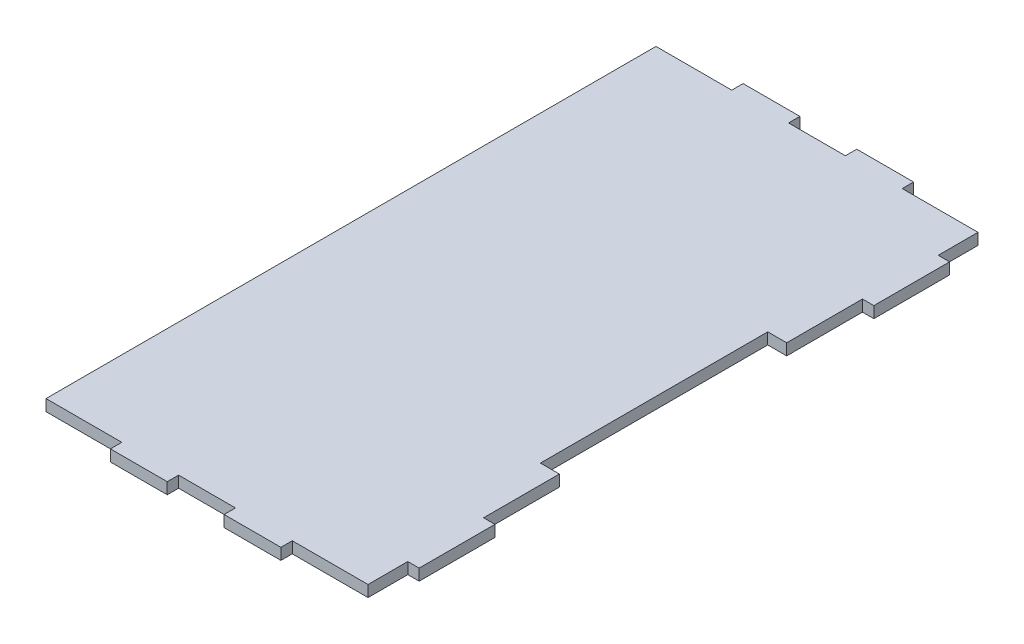
ISO-10303-21;
HEADER;
FILE_DESCRIPTION(('STEP AP214'),'2;1');
FILE_NAME('part.step','',(''),(''),'','','');
FILE_SCHEMA(('AUTOMOTIVE_DESIGN { 1 0 10303 214 1 1 1 1 }'));
ENDSEC;
DATA;
#1=APPLICATION_CONTEXT('core data for automotive mechanical design processes');
#2=APPLICATION_PROTOCOL_DEFINITION('international standard','automotive_design',2000,#1);
#3=PRODUCT_CONTEXT('',#1,'mechanical');
#4=PRODUCT('Part','Part','',(#3));
#5=PRODUCT_RELATED_PRODUCT_CATEGORY('part','',(#4));
#6=PRODUCT_DEFINITION_FORMATION('','',#4);
#7=PRODUCT_DEFINITION_CONTEXT('part definition',#1,'design');
#8=PRODUCT_DEFINITION('design','',#6,#7);
#9=PRODUCT_DEFINITION_SHAPE('','',#8);
#10=(LENGTH_UNIT() NAMED_UNIT(*) SI_UNIT(.MILLI.,.METRE.));
#11=(NAMED_UNIT(*) PLANE_ANGLE_UNIT() SI_UNIT($,.RADIAN.));
#12=(NAMED_UNIT(*) SI_UNIT($,.STERADIAN.) SOLID_ANGLE_UNIT());
#13=UNCERTAINTY_MEASURE_WITH_UNIT(LENGTH_MEASURE(1.E-05),#10,'distance_accuracy_value','');
#14=(GEOMETRIC_REPRESENTATION_CONTEXT(3) GLOBAL_UNCERTAINTY_ASSIGNED_CONTEXT((#13)) GLOBAL_UNIT_ASSIGNED_CONTEXT((#10,
#11,#12)) REPRESENTATION_CONTEXT('',''));
#15=CARTESIAN_POINT('',(0.,0.,0.));
#16=DIRECTION('',(0.,0.,1.));
#17=DIRECTION('',(1.,0.,0.));
#18=AXIS2_PLACEMENT_3D('',#15,#16,#17);
#19=CARTESIAN_POINT('',(0.,3.,-53.));
#20=DIRECTION('',(0.,0.,-1.));
#21=DIRECTION('',(-1.,0.,0.));
#22=AXIS2_PLACEMENT_3D('',#19,#20,#21);
#23=PLANE('',#22);
#24=DIRECTION('',(1.,0.,0.));
#25=VECTOR('',#24,1.);
#26=CARTESIAN_POINT('',(0.,0.,-53.));
#27=LINE('',#26,#25);
#28=CARTESIAN_POINT('',(85.5,0.,-53.));
#29=VERTEX_POINT('',#28);
#30=CARTESIAN_POINT('',(90.5,0.,-53.));
#31=VERTEX_POINT('',#30);
#32=EDGE_CURVE('E272',#29,#31,#27,.T.);
#33=ORIENTED_EDGE('',*,*,#32,.F.);
#34=DIRECTION('',(0.,-1.,0.));
#35=VECTOR('',#34,1.);
#36=CARTESIAN_POINT('',(85.5,3.,-53.));
#37=LINE('',#36,#35);
#38=CARTESIAN_POINT('',(85.5,3.,-53.));
#39=VERTEX_POINT('',#38);
#40=EDGE_CURVE('E11',#39,#29,#37,.T.);
#41=ORIENTED_EDGE('',*,*,#40,.F.);
#42=DIRECTION('',(1.,0.,0.));
#43=VECTOR('',#42,1.);
#44=CARTESIAN_POINT('',(0.,3.,-53.));
#45=LINE('',#44,#43);
#46=CARTESIAN_POINT('',(90.5,3.,-53.));
#47=VERTEX_POINT('',#46);
#48=EDGE_CURVE('E350',#39,#47,#45,.T.);
#49=ORIENTED_EDGE('',*,*,#48,.T.);
#50=DIRECTION('',(0.,-1.,0.));
#51=VECTOR('',#50,1.);
#52=CARTESIAN_POINT('',(90.5,3.,-53.));
#53=LINE('',#52,#51);
#54=EDGE_CURVE('E51',#47,#31,#53,.T.);
#55=ORIENTED_EDGE('',*,*,#54,.T.);
#56=EDGE_LOOP('',(#33,#41,#49,#55));
#57=FACE_BOUND('',#56,.T.);
#58=ADVANCED_FACE('F35',(#57),#23,.T.);
#59=CARTESIAN_POINT('',(85.5,3.,0.));
#60=DIRECTION('',(1.,0.,0.));
#61=DIRECTION('',(0.,0.,-1.));
#62=AXIS2_PLACEMENT_3D('',#59,#60,#61);
#63=PLANE('',#62);
#64=DIRECTION('',(0.,0.,1.));
#65=VECTOR('',#64,1.);
#66=CARTESIAN_POINT('',(85.5,0.,0.));
#67=LINE('',#66,#65);
#68=CARTESIAN_POINT('',(85.5,0.,-113.));
#69=VERTEX_POINT('',#68);
#70=EDGE_CURVE('E274',#69,#29,#67,.T.);
#71=ORIENTED_EDGE('',*,*,#70,.F.);
#72=DIRECTION('',(0.,-1.,0.));
#73=VECTOR('',#72,1.);
#74=CARTESIAN_POINT('',(85.5,3.,-113.));
#75=LINE('',#74,#73);
#76=CARTESIAN_POINT('',(85.5,3.,-113.));
#77=VERTEX_POINT('',#76);
#78=EDGE_CURVE('E43',#77,#69,#75,.T.);
#79=ORIENTED_EDGE('',*,*,#78,.F.);
#80=DIRECTION('',(0.,0.,1.));
#81=VECTOR('',#80,1.);
#82=CARTESIAN_POINT('',(85.5,3.,0.));
#83=LINE('',#82,#81);
#84=EDGE_CURVE('E915',#77,#39,#83,.T.);
#85=ORIENTED_EDGE('',*,*,#84,.T.);
#86=ORIENTED_EDGE('',*,*,#40,.T.);
#87=EDGE_LOOP('',(#71,#79,#85,#86));
#88=FACE_BOUND('',#87,.T.);
#89=ADVANCED_FACE('F429',(#88),#63,.T.);
#90=CARTESIAN_POINT('',(0.,3.,-113.));
#91=DIRECTION('',(0.,0.,1.));
#92=DIRECTION('',(1.,0.,0.));
#93=AXIS2_PLACEMENT_3D('',#90,#91,#92);
#94=PLANE('',#93);
#95=DIRECTION('',(-1.,0.,0.));
#96=VECTOR('',#95,1.);
#97=CARTESIAN_POINT('',(0.,0.,-113.));
#98=LINE('',#97,#96);
#99=CARTESIAN_POINT('',(90.5,0.,-113.));
#100=VERTEX_POINT('',#99);
#101=EDGE_CURVE('E277',#100,#69,#98,.T.);
#102=ORIENTED_EDGE('',*,*,#101,.F.);
#103=DIRECTION('',(0.,-1.,0.));
#104=VECTOR('',#103,1.);
#105=CARTESIAN_POINT('',(90.5,3.,-113.));
#106=LINE('',#105,#104);
#107=CARTESIAN_POINT('',(90.5,3.,-113.));
#108=VERTEX_POINT('',#107);
#109=EDGE_CURVE('E418',#108,#100,#106,.T.);
#110=ORIENTED_EDGE('',*,*,#109,.F.);
#111=DIRECTION('',(-1.,0.,0.));
#112=VECTOR('',#111,1.);
#113=CARTESIAN_POINT('',(0.,3.,-113.));
#114=LINE('',#113,#112);
#115=EDGE_CURVE('E425',#108,#77,#114,.T.);
#116=ORIENTED_EDGE('',*,*,#115,.T.);
#117=ORIENTED_EDGE('',*,*,#78,.T.);
#118=EDGE_LOOP('',(#102,#110,#116,#117));
#119=FACE_BOUND('',#118,.T.);
#120=ADVANCED_FACE('F423',(#119),#94,.T.);
#121=CARTESIAN_POINT('',(90.5,3.,0.));
#122=DIRECTION('',(-1.,0.,0.));
#123=DIRECTION('',(0.,0.,1.));
#124=AXIS2_PLACEMENT_3D('',#121,#122,#123);
#125=PLANE('',#124);
#126=DIRECTION('',(0.,0.,-1.));
#127=VECTOR('',#126,1.);
#128=CARTESIAN_POINT('',(90.5,0.,0.));
#129=LINE('',#128,#127);
#130=CARTESIAN_POINT('',(90.5,0.,-133.));
#131=VERTEX_POINT('',#130);
#132=EDGE_CURVE('E280',#100,#131,#129,.T.);
#133=ORIENTED_EDGE('',*,*,#132,.T.);
#134=DIRECTION('',(0.,-1.,0.));
#135=VECTOR('',#134,1.);
#136=CARTESIAN_POINT('',(90.5,3.,-133.));
#137=LINE('',#136,#135);
#138=CARTESIAN_POINT('',(90.5,3.,-133.));
#139=VERTEX_POINT('',#138);
#140=EDGE_CURVE('E415',#139,#131,#137,.T.);
#141=ORIENTED_EDGE('',*,*,#140,.F.);
#142=DIRECTION('',(0.,0.,-1.));
#143=VECTOR('',#142,1.);
#144=CARTESIAN_POINT('',(90.5,3.,0.));
#145=LINE('',#144,#143);
#146=EDGE_CURVE('E446',#108,#139,#145,.T.);
#147=ORIENTED_EDGE('',*,*,#146,.F.);
#148=ORIENTED_EDGE('',*,*,#109,.T.);
#149=EDGE_LOOP('',(#133,#141,#147,#148));
#150=FACE_BOUND('',#149,.T.);
#151=ADVANCED_FACE('F437',(#150),#125,.F.);
#152=CARTESIAN_POINT('',(0.,3.,-133.));
#153=DIRECTION('',(0.,0.,-1.));
#154=DIRECTION('',(-1.,0.,0.));
#155=AXIS2_PLACEMENT_3D('',#152,#153,#154);
#156=PLANE('',#155);
#157=DIRECTION('',(1.,0.,0.));
#158=VECTOR('',#157,1.);
#159=CARTESIAN_POINT('',(0.,0.,-133.));
#160=LINE('',#159,#158);
#161=CARTESIAN_POINT('',(93.5,0.,-133.));
#162=VERTEX_POINT('',#161);
#163=EDGE_CURVE('E282',#131,#162,#160,.T.);
#164=ORIENTED_EDGE('',*,*,#163,.T.);
#165=DIRECTION('',(0.,-1.,0.));
#166=VECTOR('',#165,1.);
#167=CARTESIAN_POINT('',(93.5,3.,-133.));
#168=LINE('',#167,#166);
#169=CARTESIAN_POINT('',(93.5,3.,-133.));
#170=VERTEX_POINT('',#169);
#171=EDGE_CURVE('E412',#170,#162,#168,.T.);
#172=ORIENTED_EDGE('',*,*,#171,.F.);
#173=DIRECTION('',(1.,0.,0.));
#174=VECTOR('',#173,1.);
#175=CARTESIAN_POINT('',(0.,3.,-133.));
#176=LINE('',#175,#174);
#177=EDGE_CURVE('E443',#139,#170,#176,.T.);
#178=ORIENTED_EDGE('',*,*,#177,.F.);
#179=ORIENTED_EDGE('',*,*,#140,.T.);
#180=EDGE_LOOP('',(#164,#172,#178,#179));
#181=FACE_BOUND('',#180,.T.);
#182=ADVANCED_FACE('F441',(#181),#156,.F.);
#183=CARTESIAN_POINT('',(93.5,3.,0.));
#184=DIRECTION('',(-1.,0.,0.));
#185=DIRECTION('',(0.,0.,1.));
#186=AXIS2_PLACEMENT_3D('',#183,#184,#185);
#187=PLANE('',#186);
#188=DIRECTION('',(0.,0.,-1.));
#189=VECTOR('',#188,1.);
#190=CARTESIAN_POINT('',(93.5,0.,0.));
#191=LINE('',#190,#189);
#192=CARTESIAN_POINT('',(93.5,0.,-153.));
#193=VERTEX_POINT('',#192);
#194=EDGE_CURVE('E284',#162,#193,#191,.T.);
#195=ORIENTED_EDGE('',*,*,#194,.T.);
#196=DIRECTION('',(0.,-1.,0.));
#197=VECTOR('',#196,1.);
#198=CARTESIAN_POINT('',(93.5,3.,-153.));
#199=LINE('',#198,#197);
#200=CARTESIAN_POINT('',(93.5,3.,-153.));
#201=VERTEX_POINT('',#200);
#202=EDGE_CURVE('E409',#201,#193,#199,.T.);
#203=ORIENTED_EDGE('',*,*,#202,.F.);
#204=DIRECTION('',(0.,0.,-1.));
#205=VECTOR('',#204,1.);
#206=CARTESIAN_POINT('',(93.5,3.,0.));
#207=LINE('',#206,#205);
#208=EDGE_CURVE('E445',#170,#201,#207,.T.);
#209=ORIENTED_EDGE('',*,*,#208,.F.);
#210=ORIENTED_EDGE('',*,*,#171,.T.);
#211=EDGE_LOOP('',(#195,#203,#209,#210));
#212=FACE_BOUND('',#211,.T.);
#213=ADVANCED_FACE('F529',(#212),#187,.F.);
#214=CARTESIAN_POINT('',(0.,3.,-153.));
#215=DIRECTION('',(0.,0.,1.));
#216=DIRECTION('',(1.,0.,0.));
#217=AXIS2_PLACEMENT_3D('',#214,#215,#216);
#218=PLANE('',#217);
#219=DIRECTION('',(-1.,0.,0.));
#220=VECTOR('',#219,1.);
#221=CARTESIAN_POINT('',(0.,0.,-153.));
#222=LINE('',#221,#220);
#223=CARTESIAN_POINT('',(90.5,0.,-153.));
#224=VERTEX_POINT('',#223);
#225=EDGE_CURVE('E286',#193,#224,#222,.T.);
#226=ORIENTED_EDGE('',*,*,#225,.T.);
#227=DIRECTION('',(0.,-1.,0.));
#228=VECTOR('',#227,1.);
#229=CARTESIAN_POINT('',(90.5,3.,-153.));
#230=LINE('',#229,#228);
#231=CARTESIAN_POINT('',(90.5,3.,-153.));
#232=VERTEX_POINT('',#231);
#233=EDGE_CURVE('E406',#232,#224,#230,.T.);
#234=ORIENTED_EDGE('',*,*,#233,.F.);
#235=DIRECTION('',(-1.,0.,0.));
#236=VECTOR('',#235,1.);
#237=CARTESIAN_POINT('',(0.,3.,-153.));
#238=LINE('',#237,#236);
#239=EDGE_CURVE('E448',#201,#232,#238,.T.);
#240=ORIENTED_EDGE('',*,*,#239,.F.);
#241=ORIENTED_EDGE('',*,*,#202,.T.);
#242=EDGE_LOOP('',(#226,#234,#240,#241));
#243=FACE_BOUND('',#242,.T.);
#244=ADVANCED_FACE('F532',(#243),#218,.F.);
#245=CARTESIAN_POINT('',(90.4999999999996,3.,2.39226627925182E-13));
#246=DIRECTION('',(-1.,0.,0.));
#247=DIRECTION('',(0.,0.,1.));
#248=AXIS2_PLACEMENT_3D('',#245,#246,#247);
#249=PLANE('',#248);
#250=DIRECTION('',(0.,0.,-1.));
#251=VECTOR('',#250,1.);
#252=CARTESIAN_POINT('',(90.4999999999996,0.,2.39226627925182E-13));
#253=LINE('',#252,#251);
#254=CARTESIAN_POINT('',(90.5,0.,-163.5));
#255=VERTEX_POINT('',#254);
#256=EDGE_CURVE('E288',#224,#255,#253,.T.);
#257=ORIENTED_EDGE('',*,*,#256,.T.);
#258=DIRECTION('',(0.,-1.,0.));
#259=VECTOR('',#258,1.);
#260=CARTESIAN_POINT('',(90.5,3.,-163.5));
#261=LINE('',#260,#259);
#262=CARTESIAN_POINT('',(90.5,3.,-163.5));
#263=VERTEX_POINT('',#262);
#264=EDGE_CURVE('E403',#263,#255,#261,.T.);
#265=ORIENTED_EDGE('',*,*,#264,.F.);
#266=DIRECTION('',(0.,0.,-1.));
#267=VECTOR('',#266,1.);
#268=CARTESIAN_POINT('',(90.4999999999996,3.,2.39226627925182E-13));
#269=LINE('',#268,#267);
#270=EDGE_CURVE('E454',#232,#263,#269,.T.);
#271=ORIENTED_EDGE('',*,*,#270,.F.);
#272=ORIENTED_EDGE('',*,*,#233,.T.);
#273=EDGE_LOOP('',(#257,#265,#271,#272));
#274=FACE_BOUND('',#273,.T.);
#275=ADVANCED_FACE('F536',(#274),#249,.F.);
#276=CARTESIAN_POINT('',(0.,3.,-163.5));
#277=DIRECTION('',(0.,0.,1.));
#278=DIRECTION('',(1.,0.,0.));
#279=AXIS2_PLACEMENT_3D('',#276,#277,#278);
#280=PLANE('',#279);
#281=DIRECTION('',(-1.,0.,0.));
#282=VECTOR('',#281,1.);
#283=CARTESIAN_POINT('',(0.,0.,-163.5));
#284=LINE('',#283,#282);
#285=CARTESIAN_POINT('',(70.5,0.,-163.5));
#286=VERTEX_POINT('',#285);
#287=EDGE_CURVE('E290',#255,#286,#284,.T.);
#288=ORIENTED_EDGE('',*,*,#287,.T.);
#289=DIRECTION('',(0.,-1.,0.));
#290=VECTOR('',#289,1.);
#291=CARTESIAN_POINT('',(70.5,3.,-163.5));
#292=LINE('',#291,#290);
#293=CARTESIAN_POINT('',(70.5,3.,-163.5));
#294=VERTEX_POINT('',#293);
#295=EDGE_CURVE('E401',#294,#286,#292,.T.);
#296=ORIENTED_EDGE('',*,*,#295,.F.);
#297=DIRECTION('',(-1.,0.,0.));
#298=VECTOR('',#297,1.);
#299=CARTESIAN_POINT('',(0.,3.,-163.5));
#300=LINE('',#299,#298);
#301=EDGE_CURVE('E456',#263,#294,#300,.T.);
#302=ORIENTED_EDGE('',*,*,#301,.F.);
#303=ORIENTED_EDGE('',*,*,#264,.T.);
#304=EDGE_LOOP('',(#288,#296,#302,#303));
#305=FACE_BOUND('',#304,.T.);
#306=ADVANCED_FACE('F540',(#305),#280,.F.);
#307=CARTESIAN_POINT('',(70.5,3.,0.));
#308=DIRECTION('',(1.,0.,0.));
#309=DIRECTION('',(0.,0.,-1.));
#310=AXIS2_PLACEMENT_3D('',#307,#308,#309);
#311=PLANE('',#310);
#312=DIRECTION('',(0.,0.,1.));
#313=VECTOR('',#312,1.);
#314=CARTESIAN_POINT('',(70.5,0.,0.));
#315=LINE('',#314,#313);
#316=CARTESIAN_POINT('',(70.5,0.,-166.5));
#317=VERTEX_POINT('',#316);
#318=EDGE_CURVE('E293',#317,#286,#315,.T.);
#319=ORIENTED_EDGE('',*,*,#318,.F.);
#320=DIRECTION('',(0.,-1.,0.));
#321=VECTOR('',#320,1.);
#322=CARTESIAN_POINT('',(70.5,3.,-166.5));
#323=LINE('',#322,#321);
#324=CARTESIAN_POINT('',(70.5,3.,-166.5));
#325=VERTEX_POINT('',#324);
#326=EDGE_CURVE('E399',#325,#317,#323,.T.);
#327=ORIENTED_EDGE('',*,*,#326,.F.);
#328=DIRECTION('',(0.,0.,1.));
#329=VECTOR('',#328,1.);
#330=CARTESIAN_POINT('',(70.5,3.,0.));
#331=LINE('',#330,#329);
#332=EDGE_CURVE('E458',#325,#294,#331,.T.);
#333=ORIENTED_EDGE('',*,*,#332,.T.);
#334=ORIENTED_EDGE('',*,*,#295,.T.);
#335=EDGE_LOOP('',(#319,#327,#333,#334));
#336=FACE_BOUND('',#335,.T.);
#337=ADVANCED_FACE('F544',(#336),#311,.T.);
#338=CARTESIAN_POINT('',(0.,3.,-166.5));
#339=DIRECTION('',(0.,0.,-1.));
#340=DIRECTION('',(-1.,0.,0.));
#341=AXIS2_PLACEMENT_3D('',#338,#339,#340);
#342=PLANE('',#341);
#343=DIRECTION('',(1.,0.,0.));
#344=VECTOR('',#343,1.);
#345=CARTESIAN_POINT('',(0.,0.,-166.5));
#346=LINE('',#345,#344);
#347=CARTESIAN_POINT('',(55.5,0.,-166.5));
#348=VERTEX_POINT('',#347);
#349=EDGE_CURVE('E296',#348,#317,#346,.T.);
#350=ORIENTED_EDGE('',*,*,#349,.F.);
#351=DIRECTION('',(0.,-1.,0.));
#352=VECTOR('',#351,1.);
#353=CARTESIAN_POINT('',(55.5,3.,-166.5));
#354=LINE('',#353,#352);
#355=CARTESIAN_POINT('',(55.5,3.,-166.5));
#356=VERTEX_POINT('',#355);
#357=EDGE_CURVE('E397',#356,#348,#354,.T.);
#358=ORIENTED_EDGE('',*,*,#357,.F.);
#359=DIRECTION('',(1.,0.,0.));
#360=VECTOR('',#359,1.);
#361=CARTESIAN_POINT('',(0.,3.,-166.5));
#362=LINE('',#361,#360);
#363=EDGE_CURVE('E461',#356,#325,#362,.T.);
#364=ORIENTED_EDGE('',*,*,#363,.T.);
#365=ORIENTED_EDGE('',*,*,#326,.T.);
#366=EDGE_LOOP('',(#350,#358,#364,#365));
#367=FACE_BOUND('',#366,.T.);
#368=ADVANCED_FACE('F548',(#367),#342,.T.);
#369=CARTESIAN_POINT('',(55.5,3.,0.));
#370=DIRECTION('',(-1.,0.,0.));
#371=DIRECTION('',(0.,0.,1.));
#372=AXIS2_PLACEMENT_3D('',#369,#370,#371);
#373=PLANE('',#372);
#374=DIRECTION('',(0.,0.,-1.));
#375=VECTOR('',#374,1.);
#376=CARTESIAN_POINT('',(55.5,0.,0.));
#377=LINE('',#376,#375);
#378=CARTESIAN_POINT('',(55.5,0.,-163.5));
#379=VERTEX_POINT('',#378);
#380=EDGE_CURVE('E299',#379,#348,#377,.T.);
#381=ORIENTED_EDGE('',*,*,#380,.F.);
#382=DIRECTION('',(0.,-1.,0.));
#383=VECTOR('',#382,1.);
#384=CARTESIAN_POINT('',(55.5,3.,-163.5));
#385=LINE('',#384,#383);
#386=CARTESIAN_POINT('',(55.5,3.,-163.5));
#387=VERTEX_POINT('',#386);
#388=EDGE_CURVE('E395',#387,#379,#385,.T.);
#389=ORIENTED_EDGE('',*,*,#388,.F.);
#390=DIRECTION('',(0.,0.,-1.));
#391=VECTOR('',#390,1.);
#392=CARTESIAN_POINT('',(55.5,3.,0.));
#393=LINE('',#392,#391);
#394=EDGE_CURVE('E464',#387,#356,#393,.T.);
#395=ORIENTED_EDGE('',*,*,#394,.T.);
#396=ORIENTED_EDGE('',*,*,#357,.T.);
#397=EDGE_LOOP('',(#381,#389,#395,#396));
#398=FACE_BOUND('',#397,.T.);
#399=ADVANCED_FACE('F552',(#398),#373,.T.);
#400=CARTESIAN_POINT('',(3.02535774210355E-13,3.,-163.5));
#401=DIRECTION('',(0.,0.,1.));
#402=DIRECTION('',(1.,0.,0.));
#403=AXIS2_PLACEMENT_3D('',#400,#401,#402);
#404=PLANE('',#403);
#405=DIRECTION('',(-1.,0.,0.));
#406=VECTOR('',#405,1.);
#407=CARTESIAN_POINT('',(3.02535774210355E-13,0.,-163.5));
#408=LINE('',#407,#406);
#409=CARTESIAN_POINT('',(40.5,0.,-163.5));
#410=VERTEX_POINT('',#409);
#411=EDGE_CURVE('E302',#379,#410,#408,.T.);
#412=ORIENTED_EDGE('',*,*,#411,.T.);
#413=DIRECTION('',(0.,-1.,0.));
#414=VECTOR('',#413,1.);
#415=CARTESIAN_POINT('',(40.5,3.,-163.5));
#416=LINE('',#415,#414);
#417=CARTESIAN_POINT('',(40.5,3.,-163.5));
#418=VERTEX_POINT('',#417);
#419=EDGE_CURVE('E392',#418,#410,#416,.T.);
#420=ORIENTED_EDGE('',*,*,#419,.F.);
#421=DIRECTION('',(-1.,0.,0.));
#422=VECTOR('',#421,1.);
#423=CARTESIAN_POINT('',(3.02535774210355E-13,3.,-163.5));
#424=LINE('',#423,#422);
#425=EDGE_CURVE('E467',#387,#418,#424,.T.);
#426=ORIENTED_EDGE('',*,*,#425,.F.);
#427=ORIENTED_EDGE('',*,*,#388,.T.);
#428=EDGE_LOOP('',(#412,#420,#426,#427));
#429=FACE_BOUND('',#428,.T.);
#430=ADVANCED_FACE('F556',(#429),#404,.F.);
#431=CARTESIAN_POINT('',(40.5,3.,0.));
#432=DIRECTION('',(-1.,0.,0.));
#433=DIRECTION('',(0.,0.,1.));
#434=AXIS2_PLACEMENT_3D('',#431,#432,#433);
#435=PLANE('',#434);
#436=DIRECTION('',(0.,0.,-1.));
#437=VECTOR('',#436,1.);
#438=CARTESIAN_POINT('',(40.5,0.,0.));
#439=LINE('',#438,#437);
#440=CARTESIAN_POINT('',(40.5,0.,-166.5));
#441=VERTEX_POINT('',#440);
#442=EDGE_CURVE('E304',#410,#441,#439,.T.);
#443=ORIENTED_EDGE('',*,*,#442,.T.);
#444=DIRECTION('',(0.,-1.,0.));
#445=VECTOR('',#444,1.);
#446=CARTESIAN_POINT('',(40.5,3.,-166.5));
#447=LINE('',#446,#445);
#448=CARTESIAN_POINT('',(40.5,3.,-166.5));
#449=VERTEX_POINT('',#448);
#450=EDGE_CURVE('E389',#449,#441,#447,.T.);
#451=ORIENTED_EDGE('',*,*,#450,.F.);
#452=DIRECTION('',(0.,0.,-1.));
#453=VECTOR('',#452,1.);
#454=CARTESIAN_POINT('',(40.5,3.,0.));
#455=LINE('',#454,#453);
#456=EDGE_CURVE('E469',#418,#449,#455,.T.);
#457=ORIENTED_EDGE('',*,*,#456,.F.);
#458=ORIENTED_EDGE('',*,*,#419,.T.);
#459=EDGE_LOOP('',(#443,#451,#457,#458));
#460=FACE_BOUND('',#459,.T.);
#461=ADVANCED_FACE('F560',(#460),#435,.F.);
#462=CARTESIAN_POINT('',(0.,3.,-166.5));
#463=DIRECTION('',(0.,0.,1.));
#464=DIRECTION('',(1.,0.,0.));
#465=AXIS2_PLACEMENT_3D('',#462,#463,#464);
#466=PLANE('',#465);
#467=DIRECTION('',(-1.,0.,0.));
#468=VECTOR('',#467,1.);
#469=CARTESIAN_POINT('',(0.,0.,-166.5));
#470=LINE('',#469,#468);
#471=CARTESIAN_POINT('',(25.5,0.,-166.5));
#472=VERTEX_POINT('',#471);
#473=EDGE_CURVE('E306',#441,#472,#470,.T.);
#474=ORIENTED_EDGE('',*,*,#473,.T.);
#475=DIRECTION('',(0.,-1.,0.));
#476=VECTOR('',#475,1.);
#477=CARTESIAN_POINT('',(25.5,3.,-166.5));
#478=LINE('',#477,#476);
#479=CARTESIAN_POINT('',(25.5,3.,-166.5));
#480=VERTEX_POINT('',#479);
#481=EDGE_CURVE('E386',#480,#472,#478,.T.);
#482=ORIENTED_EDGE('',*,*,#481,.F.);
#483=DIRECTION('',(-1.,0.,0.));
#484=VECTOR('',#483,1.);
#485=CARTESIAN_POINT('',(0.,3.,-166.5));
#486=LINE('',#485,#484);
#487=EDGE_CURVE('E471',#449,#480,#486,.T.);
#488=ORIENTED_EDGE('',*,*,#487,.F.);
#489=ORIENTED_EDGE('',*,*,#450,.T.);
#490=EDGE_LOOP('',(#474,#482,#488,#489));
#491=FACE_BOUND('',#490,.T.);
#492=ADVANCED_FACE('F564',(#491),#466,.F.);
#493=CARTESIAN_POINT('',(25.5,3.,0.));
#494=DIRECTION('',(1.,0.,0.));
#495=DIRECTION('',(0.,0.,-1.));
#496=AXIS2_PLACEMENT_3D('',#493,#494,#495);
#497=PLANE('',#496);
#498=DIRECTION('',(0.,0.,1.));
#499=VECTOR('',#498,1.);
#500=CARTESIAN_POINT('',(25.5,0.,0.));
#501=LINE('',#500,#499);
#502=CARTESIAN_POINT('',(25.5,0.,-163.5));
#503=VERTEX_POINT('',#502);
#504=EDGE_CURVE('E308',#472,#503,#501,.T.);
#505=ORIENTED_EDGE('',*,*,#504,.T.);
#506=DIRECTION('',(0.,-1.,0.));
#507=VECTOR('',#506,1.);
#508=CARTESIAN_POINT('',(25.5,3.,-163.5));
#509=LINE('',#508,#507);
#510=CARTESIAN_POINT('',(25.5,3.,-163.5));
#511=VERTEX_POINT('',#510);
#512=EDGE_CURVE('E383',#511,#503,#509,.T.);
#513=ORIENTED_EDGE('',*,*,#512,.F.);
#514=DIRECTION('',(0.,0.,1.));
#515=VECTOR('',#514,1.);
#516=CARTESIAN_POINT('',(25.5,3.,0.));
#517=LINE('',#516,#515);
#518=EDGE_CURVE('E473',#480,#511,#517,.T.);
#519=ORIENTED_EDGE('',*,*,#518,.F.);
#520=ORIENTED_EDGE('',*,*,#481,.T.);
#521=EDGE_LOOP('',(#505,#513,#519,#520));
#522=FACE_BOUND('',#521,.T.);
#523=ADVANCED_FACE('F568',(#522),#497,.F.);
#524=CARTESIAN_POINT('',(2.26901830657766E-13,3.,-163.5));
#525=DIRECTION('',(0.,0.,1.));
#526=DIRECTION('',(1.,0.,0.));
#527=AXIS2_PLACEMENT_3D('',#524,#525,#526);
#528=PLANE('',#527);
#529=DIRECTION('',(-1.,0.,0.));
#530=VECTOR('',#529,1.);
#531=CARTESIAN_POINT('',(2.26901830657766E-13,0.,-163.5));
#532=LINE('',#531,#530);
#533=CARTESIAN_POINT('',(5.49999999999999,0.,-163.5));
#534=VERTEX_POINT('',#533);
#535=EDGE_CURVE('E310',#503,#534,#532,.T.);
#536=ORIENTED_EDGE('',*,*,#535,.T.);
#537=DIRECTION('',(0.,-1.,0.));
#538=VECTOR('',#537,1.);
#539=CARTESIAN_POINT('',(5.49999999999999,3.,-163.5));
#540=LINE('',#539,#538);
#541=CARTESIAN_POINT('',(5.49999999999999,3.,-163.5));
#542=VERTEX_POINT('',#541);
#543=EDGE_CURVE('E380',#542,#534,#540,.T.);
#544=ORIENTED_EDGE('',*,*,#543,.F.);
#545=DIRECTION('',(-1.,0.,0.));
#546=VECTOR('',#545,1.);
#547=CARTESIAN_POINT('',(2.26901830657766E-13,3.,-163.5));
#548=LINE('',#547,#546);
#549=EDGE_CURVE('E475',#511,#542,#548,.T.);
#550=ORIENTED_EDGE('',*,*,#549,.F.);
#551=ORIENTED_EDGE('',*,*,#512,.T.);
#552=EDGE_LOOP('',(#536,#544,#550,#551));
#553=FACE_BOUND('',#552,.T.);
#554=ADVANCED_FACE('F572',(#553),#528,.F.);
#555=CARTESIAN_POINT('',(5.50000000000001,3.,0.));
#556=DIRECTION('',(1.,0.,0.));
#557=DIRECTION('',(0.,0.,-1.));
#558=AXIS2_PLACEMENT_3D('',#555,#556,#557);
#559=PLANE('',#558);
#560=DIRECTION('',(0.,0.,1.));
#561=VECTOR('',#560,1.);
#562=CARTESIAN_POINT('',(5.50000000000001,0.,0.));
#563=LINE('',#562,#561);
#564=CARTESIAN_POINT('',(5.50000000000001,0.,-2.50000000000001));
#565=VERTEX_POINT('',#564);
#566=EDGE_CURVE('E312',#534,#565,#563,.T.);
#567=ORIENTED_EDGE('',*,*,#566,.T.);
#568=DIRECTION('',(0.,-1.,0.));
#569=VECTOR('',#568,1.);
#570=CARTESIAN_POINT('',(5.50000000000001,3.,-2.50000000000001));
#571=LINE('',#570,#569);
#572=CARTESIAN_POINT('',(5.50000000000001,3.,-2.50000000000001));
#573=VERTEX_POINT('',#572);
#574=EDGE_CURVE('E378',#573,#565,#571,.T.);
#575=ORIENTED_EDGE('',*,*,#574,.F.);
#576=DIRECTION('',(0.,0.,1.));
#577=VECTOR('',#576,1.);
#578=CARTESIAN_POINT('',(5.50000000000001,3.,0.));
#579=LINE('',#578,#577);
#580=EDGE_CURVE('E477',#542,#573,#579,.T.);
#581=ORIENTED_EDGE('',*,*,#580,.F.);
#582=ORIENTED_EDGE('',*,*,#543,.T.);
#583=EDGE_LOOP('',(#567,#575,#581,#582));
#584=FACE_BOUND('',#583,.T.);
#585=ADVANCED_FACE('F576',(#584),#559,.F.);
#586=CARTESIAN_POINT('',(0.,3.,-2.50000000000001));
#587=DIRECTION('',(0.,0.,1.));
#588=DIRECTION('',(1.,0.,0.));
#589=AXIS2_PLACEMENT_3D('',#586,#587,#588);
#590=PLANE('',#589);
#591=DIRECTION('',(-1.,0.,0.));
#592=VECTOR('',#591,1.);
#593=CARTESIAN_POINT('',(0.,0.,-2.50000000000001));
#594=LINE('',#593,#592);
#595=CARTESIAN_POINT('',(25.5,0.,-2.50000000000001));
#596=VERTEX_POINT('',#595);
#597=EDGE_CURVE('E315',#596,#565,#594,.T.);
#598=ORIENTED_EDGE('',*,*,#597,.F.);
#599=DIRECTION('',(0.,-1.,0.));
#600=VECTOR('',#599,1.);
#601=CARTESIAN_POINT('',(25.5,3.,-2.50000000000001));
#602=LINE('',#601,#600);
#603=CARTESIAN_POINT('',(25.5,3.,-2.50000000000001));
#604=VERTEX_POINT('',#603);
#605=EDGE_CURVE('E376',#604,#596,#602,.T.);
#606=ORIENTED_EDGE('',*,*,#605,.F.);
#607=DIRECTION('',(-1.,0.,0.));
#608=VECTOR('',#607,1.);
#609=CARTESIAN_POINT('',(0.,3.,-2.50000000000001));
#610=LINE('',#609,#608);
#611=EDGE_CURVE('E479',#604,#573,#610,.T.);
#612=ORIENTED_EDGE('',*,*,#611,.T.);
#613=ORIENTED_EDGE('',*,*,#574,.T.);
#614=EDGE_LOOP('',(#598,#606,#612,#613));
#615=FACE_BOUND('',#614,.T.);
#616=ADVANCED_FACE('F580',(#615),#590,.T.);
#617=CARTESIAN_POINT('',(25.5,3.,0.));
#618=DIRECTION('',(-1.,0.,0.));
#619=DIRECTION('',(0.,0.,1.));
#620=AXIS2_PLACEMENT_3D('',#617,#618,#619);
#621=PLANE('',#620);
#622=DIRECTION('',(0.,0.,-1.));
#623=VECTOR('',#622,1.);
#624=CARTESIAN_POINT('',(25.5,0.,0.));
#625=LINE('',#624,#623);
#626=CARTESIAN_POINT('',(25.5,0.,0.49999999999999));
#627=VERTEX_POINT('',#626);
#628=EDGE_CURVE('E318',#627,#596,#625,.T.);
#629=ORIENTED_EDGE('',*,*,#628,.F.);
#630=DIRECTION('',(0.,-1.,0.));
#631=VECTOR('',#630,1.);
#632=CARTESIAN_POINT('',(25.5,3.,0.49999999999999));
#633=LINE('',#632,#631);
#634=CARTESIAN_POINT('',(25.5,3.,0.49999999999999));
#635=VERTEX_POINT('',#634);
#636=EDGE_CURVE('E374',#635,#627,#633,.T.);
#637=ORIENTED_EDGE('',*,*,#636,.F.);
#638=DIRECTION('',(0.,0.,-1.));
#639=VECTOR('',#638,1.);
#640=CARTESIAN_POINT('',(25.5,3.,0.));
#641=LINE('',#640,#639);
#642=EDGE_CURVE('E482',#635,#604,#641,.T.);
#643=ORIENTED_EDGE('',*,*,#642,.T.);
#644=ORIENTED_EDGE('',*,*,#605,.T.);
#645=EDGE_LOOP('',(#629,#637,#643,#644));
#646=FACE_BOUND('',#645,.T.);
#647=ADVANCED_FACE('F584',(#646),#621,.T.);
#648=CARTESIAN_POINT('',(0.,3.,0.49999999999999));
#649=DIRECTION('',(0.,0.,-1.));
#650=DIRECTION('',(-1.,0.,0.));
#651=AXIS2_PLACEMENT_3D('',#648,#649,#650);
#652=PLANE('',#651);
#653=DIRECTION('',(1.,0.,0.));
#654=VECTOR('',#653,1.);
#655=CARTESIAN_POINT('',(0.,0.,0.49999999999999));
#656=LINE('',#655,#654);
#657=CARTESIAN_POINT('',(40.5,0.,0.49999999999999));
#658=VERTEX_POINT('',#657);
#659=EDGE_CURVE('E321',#627,#658,#656,.T.);
#660=ORIENTED_EDGE('',*,*,#659,.T.);
#661=DIRECTION('',(0.,-1.,0.));
#662=VECTOR('',#661,1.);
#663=CARTESIAN_POINT('',(40.5,3.,0.49999999999999));
#664=LINE('',#663,#662);
#665=CARTESIAN_POINT('',(40.5,3.,0.49999999999999));
#666=VERTEX_POINT('',#665);
#667=EDGE_CURVE('E372',#666,#658,#664,.T.);
#668=ORIENTED_EDGE('',*,*,#667,.F.);
#669=DIRECTION('',(1.,0.,0.));
#670=VECTOR('',#669,1.);
#671=CARTESIAN_POINT('',(0.,3.,0.49999999999999));
#672=LINE('',#671,#670);
#673=EDGE_CURVE('E485',#635,#666,#672,.T.);
#674=ORIENTED_EDGE('',*,*,#673,.F.);
#675=ORIENTED_EDGE('',*,*,#636,.T.);
#676=EDGE_LOOP('',(#660,#668,#674,#675));
#677=FACE_BOUND('',#676,.T.);
#678=ADVANCED_FACE('F588',(#677),#652,.F.);
#679=CARTESIAN_POINT('',(40.5,3.,0.));
#680=DIRECTION('',(1.,0.,0.));
#681=DIRECTION('',(0.,0.,-1.));
#682=AXIS2_PLACEMENT_3D('',#679,#680,#681);
#683=PLANE('',#682);
#684=DIRECTION('',(0.,0.,1.));
#685=VECTOR('',#684,1.);
#686=CARTESIAN_POINT('',(40.5,0.,0.));
#687=LINE('',#686,#685);
#688=CARTESIAN_POINT('',(40.5,0.,-2.50000000000001));
#689=VERTEX_POINT('',#688);
#690=EDGE_CURVE('E324',#689,#658,#687,.T.);
#691=ORIENTED_EDGE('',*,*,#690,.F.);
#692=DIRECTION('',(0.,-1.,0.));
#693=VECTOR('',#692,1.);
#694=CARTESIAN_POINT('',(40.5,3.,-2.50000000000001));
#695=LINE('',#694,#693);
#696=CARTESIAN_POINT('',(40.5,3.,-2.50000000000001));
#697=VERTEX_POINT('',#696);
#698=EDGE_CURVE('E370',#697,#689,#695,.T.);
#699=ORIENTED_EDGE('',*,*,#698,.F.);
#700=DIRECTION('',(0.,0.,1.));
#701=VECTOR('',#700,1.);
#702=CARTESIAN_POINT('',(40.5,3.,0.));
#703=LINE('',#702,#701);
#704=EDGE_CURVE('E487',#697,#666,#703,.T.);
#705=ORIENTED_EDGE('',*,*,#704,.T.);
#706=ORIENTED_EDGE('',*,*,#667,.T.);
#707=EDGE_LOOP('',(#691,#699,#705,#706));
#708=FACE_BOUND('',#707,.T.);
#709=ADVANCED_FACE('F592',(#708),#683,.T.);
#710=CARTESIAN_POINT('',(0.,3.,-2.5));
#711=DIRECTION('',(0.,0.,-1.));
#712=DIRECTION('',(-1.,0.,0.));
#713=AXIS2_PLACEMENT_3D('',#710,#711,#712);
#714=PLANE('',#713);
#715=DIRECTION('',(1.,0.,0.));
#716=VECTOR('',#715,1.);
#717=CARTESIAN_POINT('',(0.,0.,-2.5));
#718=LINE('',#717,#716);
#719=CARTESIAN_POINT('',(55.5,0.,-2.50000000000001));
#720=VERTEX_POINT('',#719);
#721=EDGE_CURVE('E327',#689,#720,#718,.T.);
#722=ORIENTED_EDGE('',*,*,#721,.T.);
#723=DIRECTION('',(0.,-1.,0.));
#724=VECTOR('',#723,1.);
#725=CARTESIAN_POINT('',(55.5,3.,-2.50000000000001));
#726=LINE('',#725,#724);
#727=CARTESIAN_POINT('',(55.5,3.,-2.50000000000001));
#728=VERTEX_POINT('',#727);
#729=EDGE_CURVE('E367',#728,#720,#726,.T.);
#730=ORIENTED_EDGE('',*,*,#729,.F.);
#731=DIRECTION('',(1.,0.,0.));
#732=VECTOR('',#731,1.);
#733=CARTESIAN_POINT('',(0.,3.,-2.5));
#734=LINE('',#733,#732);
#735=EDGE_CURVE('E490',#697,#728,#734,.T.);
#736=ORIENTED_EDGE('',*,*,#735,.F.);
#737=ORIENTED_EDGE('',*,*,#698,.T.);
#738=EDGE_LOOP('',(#722,#730,#736,#737));
#739=FACE_BOUND('',#738,.T.);
#740=ADVANCED_FACE('F596',(#739),#714,.F.);
#741=CARTESIAN_POINT('',(55.5,3.,0.));
#742=DIRECTION('',(1.,0.,0.));
#743=DIRECTION('',(0.,0.,-1.));
#744=AXIS2_PLACEMENT_3D('',#741,#742,#743);
#745=PLANE('',#744);
#746=DIRECTION('',(0.,0.,1.));
#747=VECTOR('',#746,1.);
#748=CARTESIAN_POINT('',(55.5,0.,0.));
#749=LINE('',#748,#747);
#750=CARTESIAN_POINT('',(55.5,0.,0.49999999999999));
#751=VERTEX_POINT('',#750);
#752=EDGE_CURVE('E329',#720,#751,#749,.T.);
#753=ORIENTED_EDGE('',*,*,#752,.T.);
#754=DIRECTION('',(0.,-1.,0.));
#755=VECTOR('',#754,1.);
#756=CARTESIAN_POINT('',(55.5,3.,0.49999999999999));
#757=LINE('',#756,#755);
#758=CARTESIAN_POINT('',(55.5,3.,0.49999999999999));
#759=VERTEX_POINT('',#758);
#760=EDGE_CURVE('E364',#759,#751,#757,.T.);
#761=ORIENTED_EDGE('',*,*,#760,.F.);
#762=DIRECTION('',(0.,0.,1.));
#763=VECTOR('',#762,1.);
#764=CARTESIAN_POINT('',(55.5,3.,0.));
#765=LINE('',#764,#763);
#766=EDGE_CURVE('E492',#728,#759,#765,.T.);
#767=ORIENTED_EDGE('',*,*,#766,.F.);
#768=ORIENTED_EDGE('',*,*,#729,.T.);
#769=EDGE_LOOP('',(#753,#761,#767,#768));
#770=FACE_BOUND('',#769,.T.);
#771=ADVANCED_FACE('F600',(#770),#745,.F.);
#772=CARTESIAN_POINT('',(0.,3.,0.49999999999999));
#773=DIRECTION('',(0.,0.,-1.));
#774=DIRECTION('',(-1.,0.,0.));
#775=AXIS2_PLACEMENT_3D('',#772,#773,#774);
#776=PLANE('',#775);
#777=DIRECTION('',(1.,0.,0.));
#778=VECTOR('',#777,1.);
#779=CARTESIAN_POINT('',(0.,0.,0.49999999999999));
#780=LINE('',#779,#778);
#781=CARTESIAN_POINT('',(70.5,0.,0.49999999999999));
#782=VERTEX_POINT('',#781);
#783=EDGE_CURVE('E331',#751,#782,#780,.T.);
#784=ORIENTED_EDGE('',*,*,#783,.T.);
#785=DIRECTION('',(0.,-1.,0.));
#786=VECTOR('',#785,1.);
#787=CARTESIAN_POINT('',(70.5,3.,0.49999999999999));
#788=LINE('',#787,#786);
#789=CARTESIAN_POINT('',(70.5,3.,0.49999999999999));
#790=VERTEX_POINT('',#789);
#791=EDGE_CURVE('E361',#790,#782,#788,.T.);
#792=ORIENTED_EDGE('',*,*,#791,.F.);
#793=DIRECTION('',(1.,0.,0.));
#794=VECTOR('',#793,1.);
#795=CARTESIAN_POINT('',(0.,3.,0.49999999999999));
#796=LINE('',#795,#794);
#797=EDGE_CURVE('E494',#759,#790,#796,.T.);
#798=ORIENTED_EDGE('',*,*,#797,.F.);
#799=ORIENTED_EDGE('',*,*,#760,.T.);
#800=EDGE_LOOP('',(#784,#792,#798,#799));
#801=FACE_BOUND('',#800,.T.);
#802=ADVANCED_FACE('F604',(#801),#776,.F.);
#803=CARTESIAN_POINT('',(70.5,3.,0.));
#804=DIRECTION('',(-1.,0.,0.));
#805=DIRECTION('',(0.,0.,1.));
#806=AXIS2_PLACEMENT_3D('',#803,#804,#805);
#807=PLANE('',#806);
#808=DIRECTION('',(0.,0.,-1.));
#809=VECTOR('',#808,1.);
#810=CARTESIAN_POINT('',(70.5,0.,0.));
#811=LINE('',#810,#809);
#812=CARTESIAN_POINT('',(70.5,0.,-2.5));
#813=VERTEX_POINT('',#812);
#814=EDGE_CURVE('E333',#782,#813,#811,.T.);
#815=ORIENTED_EDGE('',*,*,#814,.T.);
#816=DIRECTION('',(0.,-1.,0.));
#817=VECTOR('',#816,1.);
#818=CARTESIAN_POINT('',(70.5,3.,-2.5));
#819=LINE('',#818,#817);
#820=CARTESIAN_POINT('',(70.5,3.,-2.5));
#821=VERTEX_POINT('',#820);
#822=EDGE_CURVE('E358',#821,#813,#819,.T.);
#823=ORIENTED_EDGE('',*,*,#822,.F.);
#824=DIRECTION('',(0.,0.,-1.));
#825=VECTOR('',#824,1.);
#826=CARTESIAN_POINT('',(70.5,3.,0.));
#827=LINE('',#826,#825);
#828=EDGE_CURVE('E496',#790,#821,#827,.T.);
#829=ORIENTED_EDGE('',*,*,#828,.F.);
#830=ORIENTED_EDGE('',*,*,#791,.T.);
#831=EDGE_LOOP('',(#815,#823,#829,#830));
#832=FACE_BOUND('',#831,.T.);
#833=ADVANCED_FACE('F608',(#832),#807,.F.);
#834=CARTESIAN_POINT('',(0.,3.,-2.49999999999998));
#835=DIRECTION('',(0.,0.,-1.));
#836=DIRECTION('',(-1.,0.,0.));
#837=AXIS2_PLACEMENT_3D('',#834,#835,#836);
#838=PLANE('',#837);
#839=DIRECTION('',(1.,0.,0.));
#840=VECTOR('',#839,1.);
#841=CARTESIAN_POINT('',(0.,0.,-2.49999999999998));
#842=LINE('',#841,#840);
#843=CARTESIAN_POINT('',(90.5,0.,-2.50000000000001));
#844=VERTEX_POINT('',#843);
#845=EDGE_CURVE('E335',#813,#844,#842,.T.);
#846=ORIENTED_EDGE('',*,*,#845,.T.);
#847=DIRECTION('',(0.,-1.,0.));
#848=VECTOR('',#847,1.);
#849=CARTESIAN_POINT('',(90.5,3.,-2.50000000000001));
#850=LINE('',#849,#848);
#851=CARTESIAN_POINT('',(90.5,3.,-2.50000000000001));
#852=VERTEX_POINT('',#851);
#853=EDGE_CURVE('E356',#852,#844,#850,.T.);
#854=ORIENTED_EDGE('',*,*,#853,.F.);
#855=DIRECTION('',(1.,0.,0.));
#856=VECTOR('',#855,1.);
#857=CARTESIAN_POINT('',(0.,3.,-2.49999999999998));
#858=LINE('',#857,#856);
#859=EDGE_CURVE('E498',#821,#852,#858,.T.);
#860=ORIENTED_EDGE('',*,*,#859,.F.);
#861=ORIENTED_EDGE('',*,*,#822,.T.);
#862=EDGE_LOOP('',(#846,#854,#860,#861));
#863=FACE_BOUND('',#862,.T.);
#864=ADVANCED_FACE('F612',(#863),#838,.F.);
#865=CARTESIAN_POINT('',(90.5,3.,-2.39226627925183E-13));
#866=DIRECTION('',(1.,0.,0.));
#867=DIRECTION('',(0.,0.,-1.));
#868=AXIS2_PLACEMENT_3D('',#865,#866,#867);
#869=PLANE('',#868);
#870=DIRECTION('',(0.,0.,1.));
#871=VECTOR('',#870,1.);
#872=CARTESIAN_POINT('',(90.5,0.,-2.39226627925183E-13));
#873=LINE('',#872,#871);
#874=CARTESIAN_POINT('',(90.5,0.,-13.));
#875=VERTEX_POINT('',#874);
#876=EDGE_CURVE('E338',#875,#844,#873,.T.);
#877=ORIENTED_EDGE('',*,*,#876,.F.);
#878=DIRECTION('',(0.,-1.,0.));
#879=VECTOR('',#878,1.);
#880=CARTESIAN_POINT('',(90.5,3.,-13.));
#881=LINE('',#880,#879);
#882=CARTESIAN_POINT('',(90.5,3.,-13.));
#883=VERTEX_POINT('',#882);
#884=EDGE_CURVE('E354',#883,#875,#881,.T.);
#885=ORIENTED_EDGE('',*,*,#884,.F.);
#886=DIRECTION('',(0.,0.,1.));
#887=VECTOR('',#886,1.);
#888=CARTESIAN_POINT('',(90.5,3.,-2.39226627925183E-13));
#889=LINE('',#888,#887);
#890=EDGE_CURVE('E500',#883,#852,#889,.T.);
#891=ORIENTED_EDGE('',*,*,#890,.T.);
#892=ORIENTED_EDGE('',*,*,#853,.T.);
#893=EDGE_LOOP('',(#877,#885,#891,#892));
#894=FACE_BOUND('',#893,.T.);
#895=ADVANCED_FACE('F616',(#894),#869,.T.);
#896=CARTESIAN_POINT('',(0.,3.,-13.));
#897=DIRECTION('',(0.,0.,1.));
#898=DIRECTION('',(1.,0.,0.));
#899=AXIS2_PLACEMENT_3D('',#896,#897,#898);
#900=PLANE('',#899);
#901=DIRECTION('',(-1.,0.,0.));
#902=VECTOR('',#901,1.);
#903=CARTESIAN_POINT('',(0.,0.,-13.));
#904=LINE('',#903,#902);
#905=CARTESIAN_POINT('',(93.5,0.,-13.));
#906=VERTEX_POINT('',#905);
#907=EDGE_CURVE('E341',#906,#875,#904,.T.);
#908=ORIENTED_EDGE('',*,*,#907,.F.);
#909=DIRECTION('',(0.,-1.,0.));
#910=VECTOR('',#909,1.);
#911=CARTESIAN_POINT('',(93.5,3.,-13.));
#912=LINE('',#911,#910);
#913=CARTESIAN_POINT('',(93.5,3.,-13.));
#914=VERTEX_POINT('',#913);
#915=EDGE_CURVE('E264',#914,#906,#912,.T.);
#916=ORIENTED_EDGE('',*,*,#915,.F.);
#917=DIRECTION('',(-1.,0.,0.));
#918=VECTOR('',#917,1.);
#919=CARTESIAN_POINT('',(0.,3.,-13.));
#920=LINE('',#919,#918);
#921=EDGE_CURVE('E254',#914,#883,#920,.T.);
#922=ORIENTED_EDGE('',*,*,#921,.T.);
#923=ORIENTED_EDGE('',*,*,#884,.T.);
#924=EDGE_LOOP('',(#908,#916,#922,#923));
#925=FACE_BOUND('',#924,.T.);
#926=ADVANCED_FACE('F504',(#925),#900,.T.);
#927=CARTESIAN_POINT('',(93.5,3.,0.));
#928=DIRECTION('',(-1.,0.,0.));
#929=DIRECTION('',(0.,0.,1.));
#930=AXIS2_PLACEMENT_3D('',#927,#928,#929);
#931=PLANE('',#930);
#932=DIRECTION('',(0.,0.,-1.));
#933=VECTOR('',#932,1.);
#934=CARTESIAN_POINT('',(93.5,0.,0.));
#935=LINE('',#934,#933);
#936=CARTESIAN_POINT('',(93.5,0.,-33.));
#937=VERTEX_POINT('',#936);
#938=EDGE_CURVE('E261',#906,#937,#935,.T.);
#939=ORIENTED_EDGE('',*,*,#938,.T.);
#940=DIRECTION('',(0.,-1.,0.));
#941=VECTOR('',#940,1.);
#942=CARTESIAN_POINT('',(93.5,3.,-33.));
#943=LINE('',#942,#941);
#944=CARTESIAN_POINT('',(93.5,3.,-33.));
#945=VERTEX_POINT('',#944);
#946=EDGE_CURVE('E258',#945,#937,#943,.T.);
#947=ORIENTED_EDGE('',*,*,#946,.F.);
#948=DIRECTION('',(0.,0.,-1.));
#949=VECTOR('',#948,1.);
#950=CARTESIAN_POINT('',(93.5,3.,0.));
#951=LINE('',#950,#949);
#952=EDGE_CURVE('E246',#914,#945,#951,.T.);
#953=ORIENTED_EDGE('',*,*,#952,.F.);
#954=ORIENTED_EDGE('',*,*,#915,.T.);
#955=EDGE_LOOP('',(#939,#947,#953,#954));
#956=FACE_BOUND('',#955,.T.);
#957=ADVANCED_FACE('F259',(#956),#931,.F.);
#958=CARTESIAN_POINT('',(0.,3.,-33.));
#959=DIRECTION('',(0.,0.,-1.));
#960=DIRECTION('',(-1.,0.,0.));
#961=AXIS2_PLACEMENT_3D('',#958,#959,#960);
#962=PLANE('',#961);
#963=DIRECTION('',(1.,0.,0.));
#964=VECTOR('',#963,1.);
#965=CARTESIAN_POINT('',(0.,0.,-33.));
#966=LINE('',#965,#964);
#967=CARTESIAN_POINT('',(90.5,0.,-33.));
#968=VERTEX_POINT('',#967);
#969=EDGE_CURVE('E345',#968,#937,#966,.T.);
#970=ORIENTED_EDGE('',*,*,#969,.F.);
#971=DIRECTION('',(0.,-1.,0.));
#972=VECTOR('',#971,1.);
#973=CARTESIAN_POINT('',(90.5,3.,-33.));
#974=LINE('',#973,#972);
#975=CARTESIAN_POINT('',(90.5,3.,-33.));
#976=VERTEX_POINT('',#975);
#977=EDGE_CURVE('E148',#976,#968,#974,.T.);
#978=ORIENTED_EDGE('',*,*,#977,.F.);
#979=DIRECTION('',(1.,0.,0.));
#980=VECTOR('',#979,1.);
#981=CARTESIAN_POINT('',(0.,3.,-33.));
#982=LINE('',#981,#980);
#983=EDGE_CURVE('E251',#976,#945,#982,.T.);
#984=ORIENTED_EDGE('',*,*,#983,.T.);
#985=ORIENTED_EDGE('',*,*,#946,.T.);
#986=EDGE_LOOP('',(#970,#978,#984,#985));
#987=FACE_BOUND('',#986,.T.);
#988=ADVANCED_FACE('F266',(#987),#962,.T.);
#989=CARTESIAN_POINT('',(90.5,3.,0.));
#990=DIRECTION('',(1.,0.,0.));
#991=DIRECTION('',(0.,0.,-1.));
#992=AXIS2_PLACEMENT_3D('',#989,#990,#991);
#993=PLANE('',#992);
#994=DIRECTION('',(0.,0.,1.));
#995=VECTOR('',#994,1.);
#996=CARTESIAN_POINT('',(90.5,0.,0.));
#997=LINE('',#996,#995);
#998=EDGE_CURVE('E347',#31,#968,#997,.T.);
#999=ORIENTED_EDGE('',*,*,#998,.F.);
#1000=ORIENTED_EDGE('',*,*,#54,.F.);
#1001=DIRECTION('',(0.,0.,1.));
#1002=VECTOR('',#1001,1.);
#1003=CARTESIAN_POINT('',(90.5,3.,0.));
#1004=LINE('',#1003,#1002);
#1005=EDGE_CURVE('E267',#47,#976,#1004,.T.);
#1006=ORIENTED_EDGE('',*,*,#1005,.T.);
#1007=ORIENTED_EDGE('',*,*,#977,.T.);
#1008=EDGE_LOOP('',(#999,#1000,#1006,#1007));
#1009=FACE_BOUND('',#1008,.T.);
#1010=ADVANCED_FACE('F506',(#1009),#993,.T.);
#1011=CARTESIAN_POINT('',(0.,3.,0.));
#1012=DIRECTION('',(0.,1.,0.));
#1013=DIRECTION('',(0.,0.,1.));
#1014=AXIS2_PLACEMENT_3D('',#1011,#1012,#1013);
#1015=PLANE('',#1014);
#1016=ORIENTED_EDGE('',*,*,#48,.F.);
#1017=ORIENTED_EDGE('',*,*,#84,.F.);
#1018=ORIENTED_EDGE('',*,*,#115,.F.);
#1019=ORIENTED_EDGE('',*,*,#146,.T.);
#1020=ORIENTED_EDGE('',*,*,#177,.T.);
#1021=ORIENTED_EDGE('',*,*,#208,.T.);
#1022=ORIENTED_EDGE('',*,*,#239,.T.);
#1023=ORIENTED_EDGE('',*,*,#270,.T.);
#1024=ORIENTED_EDGE('',*,*,#301,.T.);
#1025=ORIENTED_EDGE('',*,*,#332,.F.);
#1026=ORIENTED_EDGE('',*,*,#363,.F.);
#1027=ORIENTED_EDGE('',*,*,#394,.F.);
#1028=ORIENTED_EDGE('',*,*,#425,.T.);
#1029=ORIENTED_EDGE('',*,*,#456,.T.);
#1030=ORIENTED_EDGE('',*,*,#487,.T.);
#1031=ORIENTED_EDGE('',*,*,#518,.T.);
#1032=ORIENTED_EDGE('',*,*,#549,.T.);
#1033=ORIENTED_EDGE('',*,*,#580,.T.);
#1034=ORIENTED_EDGE('',*,*,#611,.F.);
#1035=ORIENTED_EDGE('',*,*,#642,.F.);
#1036=ORIENTED_EDGE('',*,*,#673,.T.);
#1037=ORIENTED_EDGE('',*,*,#704,.F.);
#1038=ORIENTED_EDGE('',*,*,#735,.T.);
#1039=ORIENTED_EDGE('',*,*,#766,.T.);
#1040=ORIENTED_EDGE('',*,*,#797,.T.);
#1041=ORIENTED_EDGE('',*,*,#828,.T.);
#1042=ORIENTED_EDGE('',*,*,#859,.T.);
#1043=ORIENTED_EDGE('',*,*,#890,.F.);
#1044=ORIENTED_EDGE('',*,*,#921,.F.);
#1045=ORIENTED_EDGE('',*,*,#952,.T.);
#1046=ORIENTED_EDGE('',*,*,#983,.F.);
#1047=ORIENTED_EDGE('',*,*,#1005,.F.);
#1048=EDGE_LOOP('',(#1016,#1017,#1018,#1019,#1020,#1021,#1022,#1023,#1024,#1025,#1026,#1027,
#1028,#1029,#1030,#1031,#1032,#1033,#1034,#1035,#1036,#1037,#1038,#1039,#1040,#1041,#1042,#1043,
#1044,#1045,#1046,#1047));
#1049=FACE_BOUND('',#1048,.T.);
#1050=ADVANCED_FACE('F248',(#1049),#1015,.T.);
#1051=CARTESIAN_POINT('',(0.,0.,0.));
#1052=DIRECTION('',(0.,1.,0.));
#1053=DIRECTION('',(0.,0.,1.));
#1054=AXIS2_PLACEMENT_3D('',#1051,#1052,#1053);
#1055=PLANE('',#1054);
#1056=ORIENTED_EDGE('',*,*,#32,.T.);
#1057=ORIENTED_EDGE('',*,*,#998,.T.);
#1058=ORIENTED_EDGE('',*,*,#969,.T.);
#1059=ORIENTED_EDGE('',*,*,#938,.F.);
#1060=ORIENTED_EDGE('',*,*,#907,.T.);
#1061=ORIENTED_EDGE('',*,*,#876,.T.);
#1062=ORIENTED_EDGE('',*,*,#845,.F.);
#1063=ORIENTED_EDGE('',*,*,#814,.F.);
#1064=ORIENTED_EDGE('',*,*,#783,.F.);
#1065=ORIENTED_EDGE('',*,*,#752,.F.);
#1066=ORIENTED_EDGE('',*,*,#721,.F.);
#1067=ORIENTED_EDGE('',*,*,#690,.T.);
#1068=ORIENTED_EDGE('',*,*,#659,.F.);
#1069=ORIENTED_EDGE('',*,*,#628,.T.);
#1070=ORIENTED_EDGE('',*,*,#597,.T.);
#1071=ORIENTED_EDGE('',*,*,#566,.F.);
#1072=ORIENTED_EDGE('',*,*,#535,.F.);
#1073=ORIENTED_EDGE('',*,*,#504,.F.);
#1074=ORIENTED_EDGE('',*,*,#473,.F.);
#1075=ORIENTED_EDGE('',*,*,#442,.F.);
#1076=ORIENTED_EDGE('',*,*,#411,.F.);
#1077=ORIENTED_EDGE('',*,*,#380,.T.);
#1078=ORIENTED_EDGE('',*,*,#349,.T.);
#1079=ORIENTED_EDGE('',*,*,#318,.T.);
#1080=ORIENTED_EDGE('',*,*,#287,.F.);
#1081=ORIENTED_EDGE('',*,*,#256,.F.);
#1082=ORIENTED_EDGE('',*,*,#225,.F.);
#1083=ORIENTED_EDGE('',*,*,#194,.F.);
#1084=ORIENTED_EDGE('',*,*,#163,.F.);
#1085=ORIENTED_EDGE('',*,*,#132,.F.);
#1086=ORIENTED_EDGE('',*,*,#101,.T.);
#1087=ORIENTED_EDGE('',*,*,#70,.T.);
#1088=EDGE_LOOP('',(#1056,#1057,#1058,#1059,#1060,#1061,#1062,#1063,#1064,#1065,#1066,#1067,
#1068,#1069,#1070,#1071,#1072,#1073,#1074,#1075,#1076,#1077,#1078,#1079,#1080,#1081,#1082,#1083,
#1084,#1085,#1086,#1087));
#1089=FACE_BOUND('',#1088,.T.);
#1090=ADVANCED_FACE('F432',(#1089),#1055,.F.);
#1091=CLOSED_SHELL('',(#58,#89,#120,#151,#182,#213,#244,#275,#306,#337,#368,#399,#430,#461,#492,
#523,#554,#585,#616,#647,#678,#709,#740,#771,#802,#833,#864,#895,#926,#957,#988,#1010,#1050,#1090));
#1092=MANIFOLD_SOLID_BREP('B2',#1091);
#1093=ADVANCED_BREP_SHAPE_REPRESENTATION('',(#18,#1092),#14);
#1094=SHAPE_DEFINITION_REPRESENTATION(#9,#1093);
ENDSEC;
END-ISO-10303-21;
